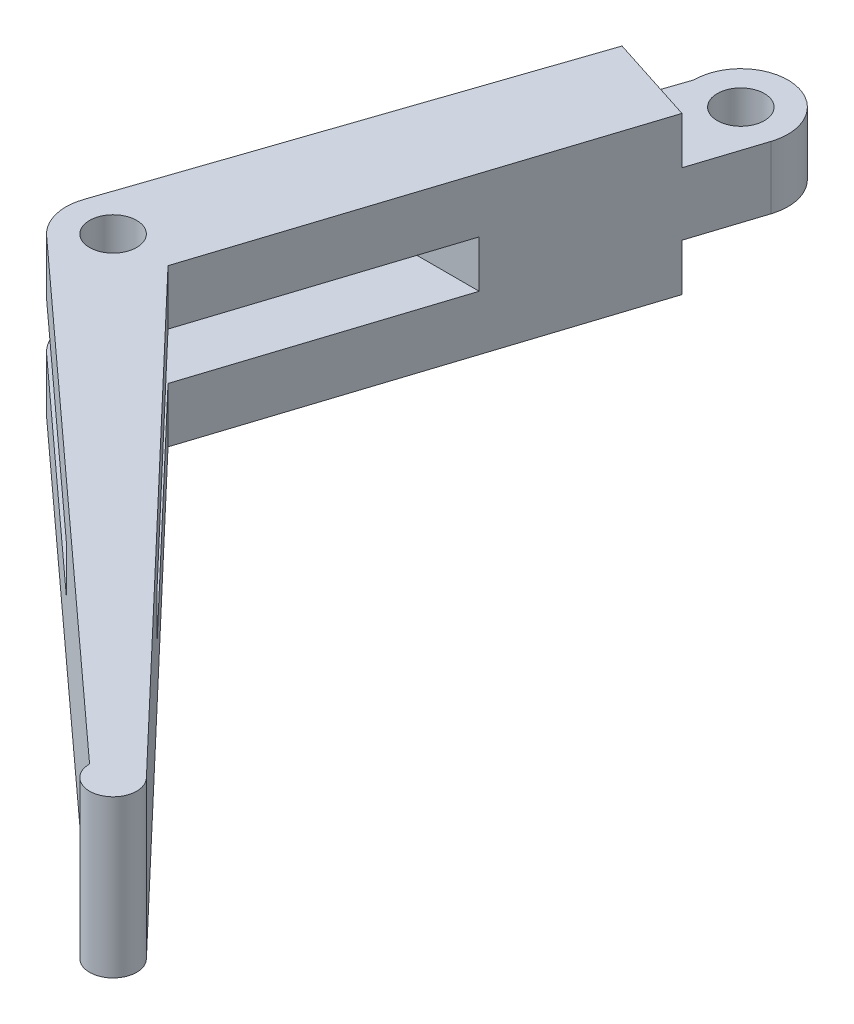
ISO-10303-21;
HEADER;
FILE_DESCRIPTION(('STEP AP214'),'2;1');
FILE_NAME('part.step','',(''),(''),'','','');
FILE_SCHEMA(('AUTOMOTIVE_DESIGN { 1 0 10303 214 1 1 1 1 }'));
ENDSEC;
DATA;
#1=APPLICATION_CONTEXT('core data for automotive mechanical design processes');
#2=APPLICATION_PROTOCOL_DEFINITION('international standard','automotive_design',2000,#1);
#3=PRODUCT_CONTEXT('',#1,'mechanical');
#4=PRODUCT('Part','Part','',(#3));
#5=PRODUCT_RELATED_PRODUCT_CATEGORY('part','',(#4));
#6=PRODUCT_DEFINITION_FORMATION('','',#4);
#7=PRODUCT_DEFINITION_CONTEXT('part definition',#1,'design');
#8=PRODUCT_DEFINITION('design','',#6,#7);
#9=PRODUCT_DEFINITION_SHAPE('','',#8);
#10=(LENGTH_UNIT() NAMED_UNIT(*) SI_UNIT(.MILLI.,.METRE.));
#11=(NAMED_UNIT(*) PLANE_ANGLE_UNIT() SI_UNIT($,.RADIAN.));
#12=(NAMED_UNIT(*) SI_UNIT($,.STERADIAN.) SOLID_ANGLE_UNIT());
#13=UNCERTAINTY_MEASURE_WITH_UNIT(LENGTH_MEASURE(1.E-05),#10,'distance_accuracy_value','');
#14=(GEOMETRIC_REPRESENTATION_CONTEXT(3) GLOBAL_UNCERTAINTY_ASSIGNED_CONTEXT((#13)) GLOBAL_UNIT_ASSIGNED_CONTEXT((#10,
#11,#12)) REPRESENTATION_CONTEXT('',''));
#15=CARTESIAN_POINT('',(0.,0.,0.));
#16=DIRECTION('',(0.,0.,1.));
#17=DIRECTION('',(1.,0.,0.));
#18=AXIS2_PLACEMENT_3D('',#15,#16,#17);
#19=CARTESIAN_POINT('',(0.,5.,0.));
#20=DIRECTION('',(0.,-1.,0.));
#21=DIRECTION('',(0.,0.,-1.));
#22=AXIS2_PLACEMENT_3D('',#19,#20,#21);
#23=CYLINDRICAL_SURFACE('',#22,3.);
#24=CARTESIAN_POINT('',(0.,-1.5,0.));
#25=DIRECTION('',(0.,-1.,0.));
#26=DIRECTION('',(0.,0.,-1.));
#27=AXIS2_PLACEMENT_3D('',#24,#25,#26);
#28=CIRCLE('',#27,3.);
#29=CARTESIAN_POINT('',(-2.01947172018885,-1.5,2.21849813417941));
#30=VERTEX_POINT('',#29);
#31=CARTESIAN_POINT('',(-2.84125157957435,-1.5,-0.962958701900683));
#32=VERTEX_POINT('',#31);
#33=EDGE_CURVE('E157',#30,#32,#28,.T.);
#34=ORIENTED_EDGE('',*,*,#33,.T.);
#35=DIRECTION('',(0.,-1.,0.));
#36=VECTOR('',#35,1.);
#37=CARTESIAN_POINT('',(-2.84125157957435,5.,-0.962958701900683));
#38=LINE('',#37,#36);
#39=CARTESIAN_POINT('',(-2.84125157957435,-5.,-0.962958701900683));
#40=VERTEX_POINT('',#39);
#41=EDGE_CURVE('E278',#32,#40,#38,.T.);
#42=ORIENTED_EDGE('',*,*,#41,.T.);
#43=CARTESIAN_POINT('',(0.,-5.,0.));
#44=DIRECTION('',(0.,1.,0.));
#45=DIRECTION('',(0.,0.,1.));
#46=AXIS2_PLACEMENT_3D('',#43,#44,#45);
#47=CIRCLE('',#46,3.);
#48=CARTESIAN_POINT('',(-2.01947172018885,-5.,2.21849813417941));
#49=VERTEX_POINT('',#48);
#50=EDGE_CURVE('E409',#40,#49,#47,.T.);
#51=ORIENTED_EDGE('',*,*,#50,.T.);
#52=DIRECTION('',(0.,-1.,0.));
#53=VECTOR('',#52,1.);
#54=CARTESIAN_POINT('',(-2.01947172018885,5.,2.21849813417941));
#55=LINE('',#54,#53);
#56=EDGE_CURVE('E418',#30,#49,#55,.T.);
#57=ORIENTED_EDGE('',*,*,#56,.F.);
#58=EDGE_LOOP('',(#34,#42,#51,#57));
#59=FACE_BOUND('',#58,.T.);
#60=ADVANCED_FACE('F135',(#59),#23,.T.);
#61=CARTESIAN_POINT('',(0.,5.,0.));
#62=DIRECTION('',(0.,-1.,0.));
#63=DIRECTION('',(0.,0.,-1.));
#64=AXIS2_PLACEMENT_3D('',#61,#62,#63);
#65=CYLINDRICAL_SURFACE('',#64,1.5);
#66=CARTESIAN_POINT('',(0.,1.5,0.));
#67=DIRECTION('',(0.,1.,0.));
#68=DIRECTION('',(0.,0.,1.));
#69=AXIS2_PLACEMENT_3D('',#66,#67,#68);
#70=CIRCLE('',#69,1.5);
#71=CARTESIAN_POINT('',(0.,1.5,1.5));
#72=VERTEX_POINT('',#71);
#73=EDGE_CURVE('E292',#72,#72,#70,.T.);
#74=ORIENTED_EDGE('',*,*,#73,.F.);
#75=EDGE_LOOP('',(#74));
#76=FACE_BOUND('',#75,.T.);
#77=CARTESIAN_POINT('',(0.,5.,0.));
#78=DIRECTION('',(0.,1.,0.));
#79=DIRECTION('',(0.,0.,1.));
#80=AXIS2_PLACEMENT_3D('',#77,#78,#79);
#81=CIRCLE('',#80,1.5);
#82=CARTESIAN_POINT('',(0.,5.,1.5));
#83=VERTEX_POINT('',#82);
#84=EDGE_CURVE('E365',#83,#83,#81,.T.);
#85=ORIENTED_EDGE('',*,*,#84,.T.);
#86=EDGE_LOOP('',(#85));
#87=FACE_BOUND('',#86,.T.);
#88=ADVANCED_FACE('F531',(#76,#87),#65,.F.);
#89=CARTESIAN_POINT('',(30.,5.,30.));
#90=DIRECTION('',(0.,1.,0.));
#91=DIRECTION('',(0.,0.,1.));
#92=AXIS2_PLACEMENT_3D('',#89,#90,#91);
#93=PLANE('',#92);
#94=ORIENTED_EDGE('',*,*,#84,.F.);
#95=EDGE_LOOP('',(#94));
#96=FACE_BOUND('',#95,.T.);
#97=DIRECTION('',(0.306255680355608,0.,-0.95194929394896));
#98=VECTOR('',#97,1.);
#99=CARTESIAN_POINT('',(3.5,5.,0.));
#100=LINE('',#99,#98);
#101=CARTESIAN_POINT('',(3.5,5.,0.));
#102=VERTEX_POINT('',#101);
#103=CARTESIAN_POINT('',(11.470961559295,5.,-24.7765240457072));
#104=VERTEX_POINT('',#103);
#105=EDGE_CURVE('E381',#102,#104,#100,.T.);
#106=ORIENTED_EDGE('',*,*,#105,.T.);
#107=DIRECTION('',(0.95194929394896,0.,0.306255680355608));
#108=VECTOR('',#107,1.);
#109=CARTESIAN_POINT('',(-4.04020291584806,5.,-29.7666871348952));
#110=LINE('',#109,#108);
#111=CARTESIAN_POINT('',(5.84327458635158,5.,-26.5870313003295));
#112=VERTEX_POINT('',#111);
#113=EDGE_CURVE('E328',#112,#104,#110,.T.);
#114=ORIENTED_EDGE('',*,*,#113,.F.);
#115=DIRECTION('',(-0.320986233966894,0.,0.947083859858117));
#116=VECTOR('',#115,1.);
#117=CARTESIAN_POINT('',(7.,5.,-30.));
#118=LINE('',#117,#116);
#119=CARTESIAN_POINT('',(-2.84125157957435,5.,-0.962958701900683));
#120=VERTEX_POINT('',#119);
#121=EDGE_CURVE('E385',#112,#120,#118,.T.);
#122=ORIENTED_EDGE('',*,*,#121,.T.);
#123=CARTESIAN_POINT('',(0.,5.,0.));
#124=DIRECTION('',(0.,1.,0.));
#125=DIRECTION('',(0.,0.,1.));
#126=AXIS2_PLACEMENT_3D('',#123,#124,#125);
#127=CIRCLE('',#126,3.);
#128=CARTESIAN_POINT('',(-2.01947172018885,5.,2.21849813417941));
#129=VERTEX_POINT('',#128);
#130=EDGE_CURVE('E388',#120,#129,#127,.T.);
#131=ORIENTED_EDGE('',*,*,#130,.T.);
#132=DIRECTION('',(0.739499378059801,0.,0.673157240062949));
#133=VECTOR('',#132,1.);
#134=CARTESIAN_POINT('',(28.5,5.,30.));
#135=LINE('',#134,#133);
#136=CARTESIAN_POINT('',(28.5,5.,30.));
#137=VERTEX_POINT('',#136);
#138=EDGE_CURVE('E391',#129,#137,#135,.T.);
#139=ORIENTED_EDGE('',*,*,#138,.T.);
#140=CARTESIAN_POINT('',(30.,5.,30.));
#141=DIRECTION('',(0.,1.,0.));
#142=DIRECTION('',(0.,0.,1.));
#143=AXIS2_PLACEMENT_3D('',#140,#141,#142);
#144=CIRCLE('',#143,1.5);
#145=CARTESIAN_POINT('',(31.0862068965517,5.,28.9655172413793));
#146=VERTEX_POINT('',#145);
#147=EDGE_CURVE('E373',#137,#146,#144,.T.);
#148=ORIENTED_EDGE('',*,*,#147,.T.);
#149=DIRECTION('',(-0.689655172413793,0.,-0.724137931034483));
#150=VECTOR('',#149,1.);
#151=CARTESIAN_POINT('',(3.5,5.,0.));
#152=LINE('',#151,#150);
#153=EDGE_CURVE('E377',#146,#102,#152,.T.);
#154=ORIENTED_EDGE('',*,*,#153,.T.);
#155=EDGE_LOOP('',(#106,#114,#122,#131,#139,#148,#154));
#156=FACE_BOUND('',#155,.T.);
#157=ADVANCED_FACE('F521',(#96,#156),#93,.T.);
#158=CARTESIAN_POINT('',(3.5,5.,0.));
#159=DIRECTION('',(-0.95194929394896,0.,-0.306255680355608));
#160=DIRECTION('',(-0.306255680355608,0.,0.95194929394896));
#161=AXIS2_PLACEMENT_3D('',#158,#159,#160);
#162=PLANE('',#161);
#163=DIRECTION('',(0.,-1.,0.));
#164=VECTOR('',#163,1.);
#165=CARTESIAN_POINT('',(3.5,5.,0.));
#166=LINE('',#165,#164);
#167=CARTESIAN_POINT('',(3.5,1.5,0.));
#168=VERTEX_POINT('',#167);
#169=EDGE_CURVE('E436',#102,#168,#166,.T.);
#170=ORIENTED_EDGE('',*,*,#169,.T.);
#171=DIRECTION('',(0.306255680355608,0.,-0.95194929394896));
#172=VECTOR('',#171,1.);
#173=CARTESIAN_POINT('',(3.5,1.5,0.));
#174=LINE('',#173,#172);
#175=CARTESIAN_POINT('',(8.32571417882729,1.5,-15.));
#176=VERTEX_POINT('',#175);
#177=EDGE_CURVE('E307',#168,#176,#174,.T.);
#178=ORIENTED_EDGE('',*,*,#177,.T.);
#179=DIRECTION('',(0.,-1.,0.));
#180=VECTOR('',#179,1.);
#181=CARTESIAN_POINT('',(8.32571417882729,5.,-15.));
#182=LINE('',#181,#180);
#183=CARTESIAN_POINT('',(8.32571417882729,-1.5,-15.));
#184=VERTEX_POINT('',#183);
#185=EDGE_CURVE('E315',#176,#184,#182,.T.);
#186=ORIENTED_EDGE('',*,*,#185,.T.);
#187=DIRECTION('',(-0.306255680355608,0.,0.95194929394896));
#188=VECTOR('',#187,1.);
#189=CARTESIAN_POINT('',(3.5,-1.5,0.));
#190=LINE('',#189,#188);
#191=CARTESIAN_POINT('',(3.5,-1.5,0.));
#192=VERTEX_POINT('',#191);
#193=EDGE_CURVE('E273',#184,#192,#190,.T.);
#194=ORIENTED_EDGE('',*,*,#193,.T.);
#195=CARTESIAN_POINT('',(3.5,-5.,0.));
#196=VERTEX_POINT('',#195);
#197=EDGE_CURVE('E435',#192,#196,#166,.T.);
#198=ORIENTED_EDGE('',*,*,#197,.T.);
#199=DIRECTION('',(0.306255680355608,0.,-0.95194929394896));
#200=VECTOR('',#199,1.);
#201=CARTESIAN_POINT('',(3.5,-5.,0.));
#202=LINE('',#201,#200);
#203=CARTESIAN_POINT('',(11.470961559295,-5.,-24.7765240457072));
#204=VERTEX_POINT('',#203);
#205=EDGE_CURVE('E402',#196,#204,#202,.T.);
#206=ORIENTED_EDGE('',*,*,#205,.T.);
#207=DIRECTION('',(0.,1.,0.));
#208=VECTOR('',#207,1.);
#209=CARTESIAN_POINT('',(11.470961559295,5.,-24.7765240457072));
#210=LINE('',#209,#208);
#211=CARTESIAN_POINT('',(11.470961559295,-2.,-24.7765240457072));
#212=VERTEX_POINT('',#211);
#213=EDGE_CURVE('E360',#204,#212,#210,.T.);
#214=ORIENTED_EDGE('',*,*,#213,.T.);
#215=DIRECTION('',(-0.306255680355608,0.,0.95194929394896));
#216=VECTOR('',#215,1.);
#217=CARTESIAN_POINT('',(3.5,-2.,0.));
#218=LINE('',#217,#216);
#219=CARTESIAN_POINT('',(12.8558478818469,-2.,-29.0812329589332));
#220=VERTEX_POINT('',#219);
#221=EDGE_CURVE('E354',#220,#212,#218,.T.);
#222=ORIENTED_EDGE('',*,*,#221,.F.);
#223=DIRECTION('',(0.,-1.,0.));
#224=VECTOR('',#223,1.);
#225=CARTESIAN_POINT('',(12.8558478818469,5.,-29.0812329589332));
#226=LINE('',#225,#224);
#227=CARTESIAN_POINT('',(12.8558478818469,2.,-29.0812329589332));
#228=VERTEX_POINT('',#227);
#229=EDGE_CURVE('E431',#228,#220,#226,.T.);
#230=ORIENTED_EDGE('',*,*,#229,.F.);
#231=DIRECTION('',(-0.306255680355608,0.,0.95194929394896));
#232=VECTOR('',#231,1.);
#233=CARTESIAN_POINT('',(3.5,2.,0.));
#234=LINE('',#233,#232);
#235=CARTESIAN_POINT('',(11.470961559295,2.,-24.7765240457072));
#236=VERTEX_POINT('',#235);
#237=EDGE_CURVE('E342',#228,#236,#234,.T.);
#238=ORIENTED_EDGE('',*,*,#237,.T.);
#239=DIRECTION('',(0.,-1.,0.));
#240=VECTOR('',#239,1.);
#241=CARTESIAN_POINT('',(11.470961559295,5.,-24.7765240457072));
#242=LINE('',#241,#240);
#243=EDGE_CURVE('E357',#104,#236,#242,.T.);
#244=ORIENTED_EDGE('',*,*,#243,.F.);
#245=ORIENTED_EDGE('',*,*,#105,.F.);
#246=EDGE_LOOP('',(#170,#178,#186,#194,#198,#206,#214,#222,#230,#238,#244,#245));
#247=FACE_BOUND('',#246,.T.);
#248=ADVANCED_FACE('F484',(#247),#162,.F.);
#249=CARTESIAN_POINT('',(10.,5.,-30.));
#250=DIRECTION('',(0.,-1.,0.));
#251=DIRECTION('',(0.,0.,-1.));
#252=AXIS2_PLACEMENT_3D('',#249,#250,#251);
#253=CYLINDRICAL_SURFACE('',#252,3.);
#254=CARTESIAN_POINT('',(10.,-2.,-30.));
#255=DIRECTION('',(0.,-1.,0.));
#256=DIRECTION('',(0.,0.,-1.));
#257=AXIS2_PLACEMENT_3D('',#254,#255,#256);
#258=CIRCLE('',#257,3.);
#259=CARTESIAN_POINT('',(7.,-2.,-30.));
#260=VERTEX_POINT('',#259);
#261=EDGE_CURVE('E351',#260,#220,#258,.T.);
#262=ORIENTED_EDGE('',*,*,#261,.F.);
#263=DIRECTION('',(0.,-1.,0.));
#264=VECTOR('',#263,1.);
#265=CARTESIAN_POINT('',(7.,5.,-30.));
#266=LINE('',#265,#264);
#267=CARTESIAN_POINT('',(7.,2.,-30.));
#268=VERTEX_POINT('',#267);
#269=EDGE_CURVE('E427',#268,#260,#266,.T.);
#270=ORIENTED_EDGE('',*,*,#269,.F.);
#271=CARTESIAN_POINT('',(10.,2.,-30.));
#272=DIRECTION('',(0.,-1.,0.));
#273=DIRECTION('',(0.,0.,-1.));
#274=AXIS2_PLACEMENT_3D('',#271,#272,#273);
#275=CIRCLE('',#274,3.);
#276=EDGE_CURVE('E338',#268,#228,#275,.T.);
#277=ORIENTED_EDGE('',*,*,#276,.T.);
#278=ORIENTED_EDGE('',*,*,#229,.T.);
#279=EDGE_LOOP('',(#262,#270,#277,#278));
#280=FACE_BOUND('',#279,.T.);
#281=ADVANCED_FACE('F510',(#280),#253,.T.);
#282=CARTESIAN_POINT('',(7.,5.,-30.));
#283=DIRECTION('',(0.947083859858117,0.,0.320986233966894));
#284=DIRECTION('',(0.320986233966894,0.,-0.947083859858117));
#285=AXIS2_PLACEMENT_3D('',#282,#283,#284);
#286=PLANE('',#285);
#287=DIRECTION('',(0.,1.,0.));
#288=VECTOR('',#287,1.);
#289=CARTESIAN_POINT('',(1.91619093770142,5.,-15.));
#290=LINE('',#289,#288);
#291=CARTESIAN_POINT('',(1.91619093770142,-1.5,-15.));
#292=VERTEX_POINT('',#291);
#293=CARTESIAN_POINT('',(1.91619093770142,1.5,-15.));
#294=VERTEX_POINT('',#293);
#295=EDGE_CURVE('E12',#292,#294,#290,.T.);
#296=ORIENTED_EDGE('',*,*,#295,.T.);
#297=DIRECTION('',(-0.320986233966894,0.,0.947083859858117));
#298=VECTOR('',#297,1.);
#299=CARTESIAN_POINT('',(7.,1.5,-30.));
#300=LINE('',#299,#298);
#301=CARTESIAN_POINT('',(-2.84125157957435,1.5,-0.962958701900683));
#302=VERTEX_POINT('',#301);
#303=EDGE_CURVE('E300',#294,#302,#300,.T.);
#304=ORIENTED_EDGE('',*,*,#303,.T.);
#305=EDGE_CURVE('E423',#120,#302,#38,.T.);
#306=ORIENTED_EDGE('',*,*,#305,.F.);
#307=ORIENTED_EDGE('',*,*,#121,.F.);
#308=DIRECTION('',(0.,1.,0.));
#309=VECTOR('',#308,1.);
#310=CARTESIAN_POINT('',(5.84327458635158,5.,-26.5870313003295));
#311=LINE('',#310,#309);
#312=CARTESIAN_POINT('',(5.84327458635158,2.,-26.5870313003295));
#313=VERTEX_POINT('',#312);
#314=EDGE_CURVE('E444',#313,#112,#311,.T.);
#315=ORIENTED_EDGE('',*,*,#314,.F.);
#316=DIRECTION('',(0.320986233966894,0.,-0.947083859858117));
#317=VECTOR('',#316,1.);
#318=CARTESIAN_POINT('',(7.,2.,-30.));
#319=LINE('',#318,#317);
#320=EDGE_CURVE('E334',#313,#268,#319,.T.);
#321=ORIENTED_EDGE('',*,*,#320,.T.);
#322=ORIENTED_EDGE('',*,*,#269,.T.);
#323=DIRECTION('',(0.320986233966894,0.,-0.947083859858117));
#324=VECTOR('',#323,1.);
#325=CARTESIAN_POINT('',(7.,-2.,-30.));
#326=LINE('',#325,#324);
#327=CARTESIAN_POINT('',(5.84327458635158,-2.,-26.5870313003295));
#328=VERTEX_POINT('',#327);
#329=EDGE_CURVE('E347',#328,#260,#326,.T.);
#330=ORIENTED_EDGE('',*,*,#329,.F.);
#331=DIRECTION('',(0.,-1.,0.));
#332=VECTOR('',#331,1.);
#333=CARTESIAN_POINT('',(5.84327458635158,5.,-26.5870313003295));
#334=LINE('',#333,#332);
#335=CARTESIAN_POINT('',(5.84327458635158,-5.,-26.5870313003295));
#336=VERTEX_POINT('',#335);
#337=EDGE_CURVE('E453',#328,#336,#334,.T.);
#338=ORIENTED_EDGE('',*,*,#337,.T.);
#339=DIRECTION('',(-0.320986233966894,0.,0.947083859858117));
#340=VECTOR('',#339,1.);
#341=CARTESIAN_POINT('',(7.,-5.,-30.));
#342=LINE('',#341,#340);
#343=EDGE_CURVE('E406',#336,#40,#342,.T.);
#344=ORIENTED_EDGE('',*,*,#343,.T.);
#345=ORIENTED_EDGE('',*,*,#41,.F.);
#346=DIRECTION('',(0.320986233966894,0.,-0.947083859858117));
#347=VECTOR('',#346,1.);
#348=CARTESIAN_POINT('',(7.,-1.5,-30.));
#349=LINE('',#348,#347);
#350=EDGE_CURVE('E270',#32,#292,#349,.T.);
#351=ORIENTED_EDGE('',*,*,#350,.T.);
#352=EDGE_LOOP('',(#296,#304,#306,#307,#315,#321,#322,#330,#338,#344,#345,#351));
#353=FACE_BOUND('',#352,.T.);
#354=ADVANCED_FACE('F276',(#353),#286,.F.);
#355=CARTESIAN_POINT('',(30.,-5.,30.));
#356=DIRECTION('',(0.,1.,0.));
#357=DIRECTION('',(0.,0.,1.));
#358=AXIS2_PLACEMENT_3D('',#355,#356,#357);
#359=PLANE('',#358);
#360=ORIENTED_EDGE('',*,*,#343,.F.);
#361=DIRECTION('',(0.95194929394896,0.,0.306255680355608));
#362=VECTOR('',#361,1.);
#363=CARTESIAN_POINT('',(-4.04020291584806,-5.,-29.7666871348952));
#364=LINE('',#363,#362);
#365=EDGE_CURVE('E319',#336,#204,#364,.T.);
#366=ORIENTED_EDGE('',*,*,#365,.T.);
#367=ORIENTED_EDGE('',*,*,#205,.F.);
#368=DIRECTION('',(-0.689655172413793,0.,-0.724137931034483));
#369=VECTOR('',#368,1.);
#370=CARTESIAN_POINT('',(3.5,-5.,0.));
#371=LINE('',#370,#369);
#372=CARTESIAN_POINT('',(31.0862068965517,-5.,28.9655172413793));
#373=VERTEX_POINT('',#372);
#374=EDGE_CURVE('E398',#373,#196,#371,.T.);
#375=ORIENTED_EDGE('',*,*,#374,.F.);
#376=CARTESIAN_POINT('',(30.,-5.,30.));
#377=DIRECTION('',(0.,1.,0.));
#378=DIRECTION('',(0.,0.,1.));
#379=AXIS2_PLACEMENT_3D('',#376,#377,#378);
#380=CIRCLE('',#379,1.5);
#381=CARTESIAN_POINT('',(28.5,-5.,30.));
#382=VERTEX_POINT('',#381);
#383=EDGE_CURVE('E369',#382,#373,#380,.T.);
#384=ORIENTED_EDGE('',*,*,#383,.F.);
#385=DIRECTION('',(0.739499378059801,0.,0.673157240062949));
#386=VECTOR('',#385,1.);
#387=CARTESIAN_POINT('',(28.5,-5.,30.));
#388=LINE('',#387,#386);
#389=EDGE_CURVE('E378',#49,#382,#388,.T.);
#390=ORIENTED_EDGE('',*,*,#389,.F.);
#391=ORIENTED_EDGE('',*,*,#50,.F.);
#392=EDGE_LOOP('',(#360,#366,#367,#375,#384,#390,#391));
#393=FACE_BOUND('',#392,.T.);
#394=CARTESIAN_POINT('',(0.,-5.,0.));
#395=DIRECTION('',(0.,1.,0.));
#396=DIRECTION('',(0.,0.,1.));
#397=AXIS2_PLACEMENT_3D('',#394,#395,#396);
#398=CIRCLE('',#397,1.5);
#399=CARTESIAN_POINT('',(0.,-5.,1.5));
#400=VERTEX_POINT('',#399);
#401=EDGE_CURVE('E364',#400,#400,#398,.T.);
#402=ORIENTED_EDGE('',*,*,#401,.T.);
#403=EDGE_LOOP('',(#402));
#404=FACE_BOUND('',#403,.T.);
#405=ADVANCED_FACE('F497',(#393,#404),#359,.F.);
#406=CARTESIAN_POINT('',(30.,5.,30.));
#407=DIRECTION('',(0.,-1.,0.));
#408=DIRECTION('',(0.,0.,-1.));
#409=AXIS2_PLACEMENT_3D('',#406,#407,#408);
#410=CYLINDRICAL_SURFACE('',#409,1.5);
#411=ORIENTED_EDGE('',*,*,#383,.T.);
#412=DIRECTION('',(0.,-1.,0.));
#413=VECTOR('',#412,1.);
#414=CARTESIAN_POINT('',(31.0862068965517,5.,28.9655172413793));
#415=LINE('',#414,#413);
#416=EDGE_CURVE('E440',#146,#373,#415,.T.);
#417=ORIENTED_EDGE('',*,*,#416,.F.);
#418=ORIENTED_EDGE('',*,*,#147,.F.);
#419=DIRECTION('',(0.,-1.,0.));
#420=VECTOR('',#419,1.);
#421=CARTESIAN_POINT('',(28.5,5.,30.));
#422=LINE('',#421,#420);
#423=EDGE_CURVE('E394',#137,#382,#422,.T.);
#424=ORIENTED_EDGE('',*,*,#423,.T.);
#425=EDGE_LOOP('',(#411,#417,#418,#424));
#426=FACE_BOUND('',#425,.T.);
#427=ADVANCED_FACE('F137',(#426),#410,.T.);
#428=CARTESIAN_POINT('',(3.5,5.,0.));
#429=DIRECTION('',(-0.724137931034483,0.,0.689655172413793));
#430=DIRECTION('',(0.689655172413793,0.,0.724137931034483));
#431=AXIS2_PLACEMENT_3D('',#428,#429,#430);
#432=PLANE('',#431);
#433=DIRECTION('',(0.,1.,0.));
#434=VECTOR('',#433,1.);
#435=CARTESIAN_POINT('',(17.7857142857143,5.,15.));
#436=LINE('',#435,#434);
#437=CARTESIAN_POINT('',(17.7857142857143,-1.5,15.));
#438=VERTEX_POINT('',#437);
#439=CARTESIAN_POINT('',(17.7857142857143,1.5,15.));
#440=VERTEX_POINT('',#439);
#441=EDGE_CURVE('E311',#438,#440,#436,.T.);
#442=ORIENTED_EDGE('',*,*,#441,.T.);
#443=DIRECTION('',(-0.689655172413793,0.,-0.724137931034483));
#444=VECTOR('',#443,1.);
#445=CARTESIAN_POINT('',(3.5,1.5,0.));
#446=LINE('',#445,#444);
#447=EDGE_CURVE('E303',#440,#168,#446,.T.);
#448=ORIENTED_EDGE('',*,*,#447,.T.);
#449=ORIENTED_EDGE('',*,*,#169,.F.);
#450=ORIENTED_EDGE('',*,*,#153,.F.);
#451=ORIENTED_EDGE('',*,*,#416,.T.);
#452=ORIENTED_EDGE('',*,*,#374,.T.);
#453=ORIENTED_EDGE('',*,*,#197,.F.);
#454=DIRECTION('',(0.689655172413793,0.,0.724137931034483));
#455=VECTOR('',#454,1.);
#456=CARTESIAN_POINT('',(3.5,-1.5,0.));
#457=LINE('',#456,#455);
#458=EDGE_CURVE('E280',#192,#438,#457,.T.);
#459=ORIENTED_EDGE('',*,*,#458,.T.);
#460=EDGE_LOOP('',(#442,#448,#449,#450,#451,#452,#453,#459));
#461=FACE_BOUND('',#460,.T.);
#462=ADVANCED_FACE('F489',(#461),#432,.F.);
#463=CARTESIAN_POINT('',(0.,1.5,0.));
#464=DIRECTION('',(0.,1.,0.));
#465=DIRECTION('',(0.,0.,1.));
#466=AXIS2_PLACEMENT_3D('',#463,#464,#465);
#467=CIRCLE('',#466,3.);
#468=CARTESIAN_POINT('',(-2.01947172018885,1.5,2.2184981341794));
#469=VERTEX_POINT('',#468);
#470=EDGE_CURVE('E297',#302,#469,#467,.T.);
#471=ORIENTED_EDGE('',*,*,#470,.T.);
#472=EDGE_CURVE('E419',#129,#469,#55,.T.);
#473=ORIENTED_EDGE('',*,*,#472,.F.);
#474=ORIENTED_EDGE('',*,*,#130,.F.);
#475=ORIENTED_EDGE('',*,*,#305,.T.);
#476=EDGE_LOOP('',(#471,#473,#474,#475));
#477=FACE_BOUND('',#476,.T.);
#478=ADVANCED_FACE('F533',(#477),#23,.T.);
#479=CARTESIAN_POINT('',(28.5,5.,30.));
#480=DIRECTION('',(0.673157240062949,0.,-0.739499378059802));
#481=DIRECTION('',(-0.739499378059802,0.,-0.673157240062949));
#482=AXIS2_PLACEMENT_3D('',#479,#480,#481);
#483=PLANE('',#482);
#484=ORIENTED_EDGE('',*,*,#472,.T.);
#485=DIRECTION('',(0.739499378059802,0.,0.673157240062949));
#486=VECTOR('',#485,1.);
#487=CARTESIAN_POINT('',(28.5,1.5,30.));
#488=LINE('',#487,#486);
#489=CARTESIAN_POINT('',(12.0216944708791,1.5,15.));
#490=VERTEX_POINT('',#489);
#491=EDGE_CURVE('E293',#469,#490,#488,.T.);
#492=ORIENTED_EDGE('',*,*,#491,.T.);
#493=DIRECTION('',(0.,-1.,0.));
#494=VECTOR('',#493,1.);
#495=CARTESIAN_POINT('',(12.0216944708791,5.,15.));
#496=LINE('',#495,#494);
#497=CARTESIAN_POINT('',(12.0216944708791,-1.5,15.));
#498=VERTEX_POINT('',#497);
#499=EDGE_CURVE('E144',#490,#498,#496,.T.);
#500=ORIENTED_EDGE('',*,*,#499,.T.);
#501=DIRECTION('',(-0.739499378059802,0.,-0.673157240062949));
#502=VECTOR('',#501,1.);
#503=CARTESIAN_POINT('',(28.5,-1.5,30.));
#504=LINE('',#503,#502);
#505=EDGE_CURVE('E286',#498,#30,#504,.T.);
#506=ORIENTED_EDGE('',*,*,#505,.T.);
#507=ORIENTED_EDGE('',*,*,#56,.T.);
#508=ORIENTED_EDGE('',*,*,#389,.T.);
#509=ORIENTED_EDGE('',*,*,#423,.F.);
#510=ORIENTED_EDGE('',*,*,#138,.F.);
#511=EDGE_LOOP('',(#484,#492,#500,#506,#507,#508,#509,#510));
#512=FACE_BOUND('',#511,.T.);
#513=ADVANCED_FACE('F467',(#512),#483,.F.);
#514=CARTESIAN_POINT('',(0.,-1.5,0.));
#515=DIRECTION('',(0.,-1.,0.));
#516=DIRECTION('',(0.,0.,-1.));
#517=AXIS2_PLACEMENT_3D('',#514,#515,#516);
#518=CIRCLE('',#517,1.5);
#519=CARTESIAN_POINT('',(0.,-1.5,-1.5));
#520=VERTEX_POINT('',#519);
#521=EDGE_CURVE('E457',#520,#520,#518,.T.);
#522=ORIENTED_EDGE('',*,*,#521,.F.);
#523=EDGE_LOOP('',(#522));
#524=FACE_BOUND('',#523,.T.);
#525=ORIENTED_EDGE('',*,*,#401,.F.);
#526=EDGE_LOOP('',(#525));
#527=FACE_BOUND('',#526,.T.);
#528=ADVANCED_FACE('F539',(#524,#527),#65,.F.);
#529=CARTESIAN_POINT('',(-4.04020291584806,2.,-29.7666871348952));
#530=DIRECTION('',(0.306255680355608,0.,-0.95194929394896));
#531=DIRECTION('',(-0.95194929394896,0.,-0.306255680355608));
#532=AXIS2_PLACEMENT_3D('',#529,#530,#531);
#533=PLANE('',#532);
#534=ORIENTED_EDGE('',*,*,#243,.T.);
#535=DIRECTION('',(0.95194929394896,0.,0.306255680355608));
#536=VECTOR('',#535,1.);
#537=CARTESIAN_POINT('',(-4.04020291584806,2.,-29.7666871348952));
#538=LINE('',#537,#536);
#539=EDGE_CURVE('E318',#313,#236,#538,.T.);
#540=ORIENTED_EDGE('',*,*,#539,.F.);
#541=ORIENTED_EDGE('',*,*,#314,.T.);
#542=ORIENTED_EDGE('',*,*,#113,.T.);
#543=EDGE_LOOP('',(#534,#540,#541,#542));
#544=FACE_BOUND('',#543,.T.);
#545=ADVANCED_FACE('F519',(#544),#533,.T.);
#546=CARTESIAN_POINT('',(-12.3394383712683,2.,-3.96977351379966));
#547=DIRECTION('',(0.,-1.,0.));
#548=DIRECTION('',(0.,0.,-1.));
#549=AXIS2_PLACEMENT_3D('',#546,#547,#548);
#550=PLANE('',#549);
#551=CARTESIAN_POINT('',(10.,2.,-30.));
#552=DIRECTION('',(0.,-1.,0.));
#553=DIRECTION('',(0.,0.,-1.));
#554=AXIS2_PLACEMENT_3D('',#551,#552,#553);
#555=CIRCLE('',#554,1.5);
#556=CARTESIAN_POINT('',(10.,2.,-31.5));
#557=VERTEX_POINT('',#556);
#558=EDGE_CURVE('E323',#557,#557,#555,.T.);
#559=ORIENTED_EDGE('',*,*,#558,.T.);
#560=EDGE_LOOP('',(#559));
#561=FACE_BOUND('',#560,.T.);
#562=ORIENTED_EDGE('',*,*,#276,.F.);
#563=ORIENTED_EDGE('',*,*,#320,.F.);
#564=ORIENTED_EDGE('',*,*,#539,.T.);
#565=ORIENTED_EDGE('',*,*,#237,.F.);
#566=EDGE_LOOP('',(#562,#563,#564,#565));
#567=FACE_BOUND('',#566,.T.);
#568=ADVANCED_FACE('F513',(#561,#567),#550,.F.);
#569=CARTESIAN_POINT('',(-4.04020291584806,-2.,-29.7666871348952));
#570=DIRECTION('',(-0.306255680355608,0.,0.95194929394896));
#571=DIRECTION('',(0.95194929394896,0.,0.306255680355608));
#572=AXIS2_PLACEMENT_3D('',#569,#570,#571);
#573=PLANE('',#572);
#574=ORIENTED_EDGE('',*,*,#365,.F.);
#575=ORIENTED_EDGE('',*,*,#337,.F.);
#576=DIRECTION('',(0.95194929394896,0.,0.306255680355608));
#577=VECTOR('',#576,1.);
#578=CARTESIAN_POINT('',(-4.04020291584806,-2.,-29.7666871348952));
#579=LINE('',#578,#577);
#580=EDGE_CURVE('E324',#328,#212,#579,.T.);
#581=ORIENTED_EDGE('',*,*,#580,.T.);
#582=ORIENTED_EDGE('',*,*,#213,.F.);
#583=EDGE_LOOP('',(#574,#575,#581,#582));
#584=FACE_BOUND('',#583,.T.);
#585=ADVANCED_FACE('F501',(#584),#573,.F.);
#586=CARTESIAN_POINT('',(-12.3394383712683,-2.,-3.96977351379966));
#587=DIRECTION('',(0.,-1.,0.));
#588=DIRECTION('',(0.,0.,-1.));
#589=AXIS2_PLACEMENT_3D('',#586,#587,#588);
#590=PLANE('',#589);
#591=CARTESIAN_POINT('',(10.,-2.,-30.));
#592=DIRECTION('',(0.,-1.,0.));
#593=DIRECTION('',(0.,0.,-1.));
#594=AXIS2_PLACEMENT_3D('',#591,#592,#593);
#595=CIRCLE('',#594,1.5);
#596=CARTESIAN_POINT('',(10.,-2.,-31.5));
#597=VERTEX_POINT('',#596);
#598=EDGE_CURVE('E346',#597,#597,#595,.T.);
#599=ORIENTED_EDGE('',*,*,#598,.F.);
#600=EDGE_LOOP('',(#599));
#601=FACE_BOUND('',#600,.T.);
#602=ORIENTED_EDGE('',*,*,#221,.T.);
#603=ORIENTED_EDGE('',*,*,#580,.F.);
#604=ORIENTED_EDGE('',*,*,#329,.T.);
#605=ORIENTED_EDGE('',*,*,#261,.T.);
#606=EDGE_LOOP('',(#602,#603,#604,#605));
#607=FACE_BOUND('',#606,.T.);
#608=ADVANCED_FACE('F506',(#601,#607),#590,.T.);
#609=CARTESIAN_POINT('',(10.,5.,-30.));
#610=DIRECTION('',(0.,-1.,0.));
#611=DIRECTION('',(0.,0.,-1.));
#612=AXIS2_PLACEMENT_3D('',#609,#610,#611);
#613=CYLINDRICAL_SURFACE('',#612,1.5);
#614=ORIENTED_EDGE('',*,*,#558,.F.);
#615=EDGE_LOOP('',(#614));
#616=FACE_BOUND('',#615,.T.);
#617=ORIENTED_EDGE('',*,*,#598,.T.);
#618=EDGE_LOOP('',(#617));
#619=FACE_BOUND('',#618,.T.);
#620=ADVANCED_FACE('F570',(#616,#619),#613,.F.);
#621=CARTESIAN_POINT('',(-3.,-1.5,-15.));
#622=DIRECTION('',(0.,0.,-1.));
#623=DIRECTION('',(-1.,0.,0.));
#624=AXIS2_PLACEMENT_3D('',#621,#622,#623);
#625=PLANE('',#624);
#626=DIRECTION('',(1.,0.,0.));
#627=VECTOR('',#626,1.);
#628=CARTESIAN_POINT('',(-3.,1.5,-15.));
#629=LINE('',#628,#627);
#630=EDGE_CURVE('E265',#294,#176,#629,.T.);
#631=ORIENTED_EDGE('',*,*,#630,.F.);
#632=ORIENTED_EDGE('',*,*,#295,.F.);
#633=DIRECTION('',(1.,0.,0.));
#634=VECTOR('',#633,1.);
#635=CARTESIAN_POINT('',(-3.,-1.5,-15.));
#636=LINE('',#635,#634);
#637=EDGE_CURVE('E262',#292,#184,#636,.T.);
#638=ORIENTED_EDGE('',*,*,#637,.T.);
#639=ORIENTED_EDGE('',*,*,#185,.F.);
#640=EDGE_LOOP('',(#631,#632,#638,#639));
#641=FACE_BOUND('',#640,.T.);
#642=ADVANCED_FACE('F261',(#641),#625,.F.);
#643=CARTESIAN_POINT('',(-3.,-1.5,15.));
#644=DIRECTION('',(0.,0.,1.));
#645=DIRECTION('',(1.,0.,0.));
#646=AXIS2_PLACEMENT_3D('',#643,#644,#645);
#647=PLANE('',#646);
#648=DIRECTION('',(1.,0.,0.));
#649=VECTOR('',#648,1.);
#650=CARTESIAN_POINT('',(-3.,-1.5,15.));
#651=LINE('',#650,#649);
#652=EDGE_CURVE('E151',#498,#438,#651,.T.);
#653=ORIENTED_EDGE('',*,*,#652,.F.);
#654=ORIENTED_EDGE('',*,*,#499,.F.);
#655=DIRECTION('',(1.,0.,0.));
#656=VECTOR('',#655,1.);
#657=CARTESIAN_POINT('',(-3.,1.5,15.));
#658=LINE('',#657,#656);
#659=EDGE_CURVE('E461',#490,#440,#658,.T.);
#660=ORIENTED_EDGE('',*,*,#659,.T.);
#661=ORIENTED_EDGE('',*,*,#441,.F.);
#662=EDGE_LOOP('',(#653,#654,#660,#661));
#663=FACE_BOUND('',#662,.T.);
#664=ADVANCED_FACE('F473',(#663),#647,.F.);
#665=CARTESIAN_POINT('',(-3.,1.5,-15.));
#666=DIRECTION('',(0.,1.,0.));
#667=DIRECTION('',(0.,0.,1.));
#668=AXIS2_PLACEMENT_3D('',#665,#666,#667);
#669=PLANE('',#668);
#670=ORIENTED_EDGE('',*,*,#73,.T.);
#671=EDGE_LOOP('',(#670));
#672=FACE_BOUND('',#671,.T.);
#673=ORIENTED_EDGE('',*,*,#447,.F.);
#674=ORIENTED_EDGE('',*,*,#659,.F.);
#675=ORIENTED_EDGE('',*,*,#491,.F.);
#676=ORIENTED_EDGE('',*,*,#470,.F.);
#677=ORIENTED_EDGE('',*,*,#303,.F.);
#678=ORIENTED_EDGE('',*,*,#630,.T.);
#679=ORIENTED_EDGE('',*,*,#177,.F.);
#680=EDGE_LOOP('',(#673,#674,#675,#676,#677,#678,#679));
#681=FACE_BOUND('',#680,.T.);
#682=ADVANCED_FACE('F475',(#672,#681),#669,.F.);
#683=CARTESIAN_POINT('',(-3.,-1.5,-15.));
#684=DIRECTION('',(0.,-1.,0.));
#685=DIRECTION('',(0.,0.,-1.));
#686=AXIS2_PLACEMENT_3D('',#683,#684,#685);
#687=PLANE('',#686);
#688=ORIENTED_EDGE('',*,*,#521,.T.);
#689=EDGE_LOOP('',(#688));
#690=FACE_BOUND('',#689,.T.);
#691=ORIENTED_EDGE('',*,*,#637,.F.);
#692=ORIENTED_EDGE('',*,*,#350,.F.);
#693=ORIENTED_EDGE('',*,*,#33,.F.);
#694=ORIENTED_EDGE('',*,*,#505,.F.);
#695=ORIENTED_EDGE('',*,*,#652,.T.);
#696=ORIENTED_EDGE('',*,*,#458,.F.);
#697=ORIENTED_EDGE('',*,*,#193,.F.);
#698=EDGE_LOOP('',(#691,#692,#693,#694,#695,#696,#697));
#699=FACE_BOUND('',#698,.T.);
#700=ADVANCED_FACE('F269',(#690,#699),#687,.F.);
#701=CLOSED_SHELL('',(#60,#88,#157,#248,#281,#354,#405,#427,#462,#478,#513,#528,#545,#568,#585,
#608,#620,#642,#664,#682,#700));
#702=MANIFOLD_SOLID_BREP('B2',#701);
#703=ADVANCED_BREP_SHAPE_REPRESENTATION('',(#18,#702),#14);
#704=SHAPE_DEFINITION_REPRESENTATION(#9,#703);
ENDSEC;
END-ISO-10303-21;
